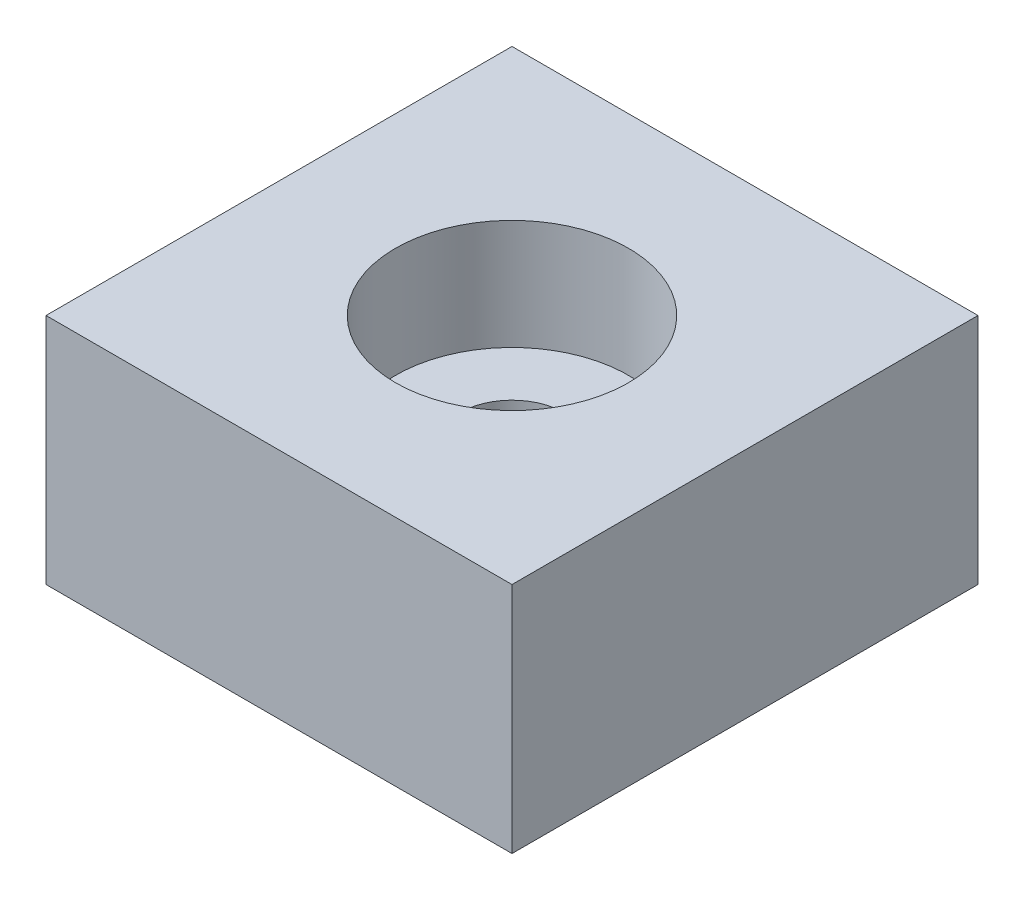
ISO-10303-21;
HEADER;
FILE_DESCRIPTION(('STEP AP214'),'2;1');
FILE_NAME('part.step','',(''),(''),'','','');
FILE_SCHEMA(('AUTOMOTIVE_DESIGN { 1 0 10303 214 1 1 1 1 }'));
ENDSEC;
DATA;
#1=APPLICATION_CONTEXT('core data for automotive mechanical design processes');
#2=APPLICATION_PROTOCOL_DEFINITION('international standard','automotive_design',2000,#1);
#3=PRODUCT_CONTEXT('',#1,'mechanical');
#4=PRODUCT('Part','Part','',(#3));
#5=PRODUCT_RELATED_PRODUCT_CATEGORY('part','',(#4));
#6=PRODUCT_DEFINITION_FORMATION('','',#4);
#7=PRODUCT_DEFINITION_CONTEXT('part definition',#1,'design');
#8=PRODUCT_DEFINITION('design','',#6,#7);
#9=PRODUCT_DEFINITION_SHAPE('','',#8);
#10=(LENGTH_UNIT() NAMED_UNIT(*) SI_UNIT(.MILLI.,.METRE.));
#11=(NAMED_UNIT(*) PLANE_ANGLE_UNIT() SI_UNIT($,.RADIAN.));
#12=(NAMED_UNIT(*) SI_UNIT($,.STERADIAN.) SOLID_ANGLE_UNIT());
#13=UNCERTAINTY_MEASURE_WITH_UNIT(LENGTH_MEASURE(1.E-05),#10,'distance_accuracy_value','');
#14=(GEOMETRIC_REPRESENTATION_CONTEXT(3) GLOBAL_UNCERTAINTY_ASSIGNED_CONTEXT((#13)) GLOBAL_UNIT_ASSIGNED_CONTEXT((#10,
#11,#12)) REPRESENTATION_CONTEXT('',''));
#15=CARTESIAN_POINT('',(0.,0.,0.));
#16=DIRECTION('',(0.,0.,1.));
#17=DIRECTION('',(1.,0.,0.));
#18=AXIS2_PLACEMENT_3D('',#15,#16,#17);
#19=CARTESIAN_POINT('',(0.,19.05,0.));
#20=DIRECTION('',(0.,1.,0.));
#21=DIRECTION('',(0.,0.,1.));
#22=AXIS2_PLACEMENT_3D('',#19,#20,#21);
#23=CYLINDRICAL_SURFACE('',#22,4.25);
#24=CARTESIAN_POINT('',(0.,0.,0.));
#25=DIRECTION('',(0.,1.,0.));
#26=DIRECTION('',(0.,0.,1.));
#27=AXIS2_PLACEMENT_3D('',#24,#25,#26);
#28=CIRCLE('',#27,4.25);
#29=CARTESIAN_POINT('',(0.,0.,4.25));
#30=VERTEX_POINT('',#29);
#31=EDGE_CURVE('E121',#30,#30,#28,.T.);
#32=ORIENTED_EDGE('',*,*,#31,.F.);
#33=EDGE_LOOP('',(#32));
#34=FACE_BOUND('',#33,.T.);
#35=CARTESIAN_POINT('',(0.,10.05,0.));
#36=DIRECTION('',(0.,1.,0.));
#37=DIRECTION('',(0.,0.,1.));
#38=AXIS2_PLACEMENT_3D('',#35,#36,#37);
#39=CIRCLE('',#38,4.25);
#40=CARTESIAN_POINT('',(0.,10.05,4.25));
#41=VERTEX_POINT('',#40);
#42=EDGE_CURVE('E56',#41,#41,#39,.F.);
#43=ORIENTED_EDGE('',*,*,#42,.F.);
#44=EDGE_LOOP('',(#43));
#45=FACE_BOUND('',#44,.T.);
#46=ADVANCED_FACE('F52',(#34,#45),#23,.F.);
#47=CARTESIAN_POINT('',(19.05,19.05,19.05));
#48=DIRECTION('',(-1.,0.,0.));
#49=DIRECTION('',(0.,0.,1.));
#50=AXIS2_PLACEMENT_3D('',#47,#48,#49);
#51=PLANE('',#50);
#52=DIRECTION('',(0.,0.,-1.));
#53=VECTOR('',#52,1.);
#54=CARTESIAN_POINT('',(19.05,0.,19.05));
#55=LINE('',#54,#53);
#56=CARTESIAN_POINT('',(19.05,0.,19.05));
#57=VERTEX_POINT('',#56);
#58=CARTESIAN_POINT('',(19.05,0.,-19.05));
#59=VERTEX_POINT('',#58);
#60=EDGE_CURVE('E118',#57,#59,#55,.T.);
#61=ORIENTED_EDGE('',*,*,#60,.T.);
#62=DIRECTION('',(0.,-1.,0.));
#63=VECTOR('',#62,1.);
#64=CARTESIAN_POINT('',(19.05,19.05,-19.05));
#65=LINE('',#64,#63);
#66=CARTESIAN_POINT('',(19.05,19.05,-19.05));
#67=VERTEX_POINT('',#66);
#68=EDGE_CURVE('E11',#67,#59,#65,.T.);
#69=ORIENTED_EDGE('',*,*,#68,.F.);
#70=DIRECTION('',(0.,0.,-1.));
#71=VECTOR('',#70,1.);
#72=CARTESIAN_POINT('',(19.05,19.05,19.05));
#73=LINE('',#72,#71);
#74=CARTESIAN_POINT('',(19.05,19.05,19.05));
#75=VERTEX_POINT('',#74);
#76=EDGE_CURVE('E105',#75,#67,#73,.T.);
#77=ORIENTED_EDGE('',*,*,#76,.F.);
#78=DIRECTION('',(0.,-1.,0.));
#79=VECTOR('',#78,1.);
#80=CARTESIAN_POINT('',(19.05,19.05,19.05));
#81=LINE('',#80,#79);
#82=EDGE_CURVE('E114',#75,#57,#81,.T.);
#83=ORIENTED_EDGE('',*,*,#82,.T.);
#84=EDGE_LOOP('',(#61,#69,#77,#83));
#85=FACE_BOUND('',#84,.T.);
#86=ADVANCED_FACE('F54',(#85),#51,.F.);
#87=CARTESIAN_POINT('',(-19.05,19.05,-19.05));
#88=DIRECTION('',(0.,0.,1.));
#89=DIRECTION('',(1.,0.,0.));
#90=AXIS2_PLACEMENT_3D('',#87,#88,#89);
#91=PLANE('',#90);
#92=DIRECTION('',(-1.,0.,0.));
#93=VECTOR('',#92,1.);
#94=CARTESIAN_POINT('',(-19.05,0.,-19.05));
#95=LINE('',#94,#93);
#96=CARTESIAN_POINT('',(-19.05,0.,-19.05));
#97=VERTEX_POINT('',#96);
#98=EDGE_CURVE('E109',#59,#97,#95,.T.);
#99=ORIENTED_EDGE('',*,*,#98,.T.);
#100=DIRECTION('',(0.,-1.,0.));
#101=VECTOR('',#100,1.);
#102=CARTESIAN_POINT('',(-19.05,19.05,-19.05));
#103=LINE('',#102,#101);
#104=CARTESIAN_POINT('',(-19.05,19.05,-19.05));
#105=VERTEX_POINT('',#104);
#106=EDGE_CURVE('E62',#105,#97,#103,.T.);
#107=ORIENTED_EDGE('',*,*,#106,.F.);
#108=DIRECTION('',(-1.,0.,0.));
#109=VECTOR('',#108,1.);
#110=CARTESIAN_POINT('',(-19.05,19.05,-19.05));
#111=LINE('',#110,#109);
#112=EDGE_CURVE('E100',#67,#105,#111,.T.);
#113=ORIENTED_EDGE('',*,*,#112,.F.);
#114=ORIENTED_EDGE('',*,*,#68,.T.);
#115=EDGE_LOOP('',(#99,#107,#113,#114));
#116=FACE_BOUND('',#115,.T.);
#117=ADVANCED_FACE('F108',(#116),#91,.F.);
#118=CARTESIAN_POINT('',(-19.05,19.05,19.05));
#119=DIRECTION('',(1.,0.,0.));
#120=DIRECTION('',(0.,0.,-1.));
#121=AXIS2_PLACEMENT_3D('',#118,#119,#120);
#122=PLANE('',#121);
#123=DIRECTION('',(0.,0.,1.));
#124=VECTOR('',#123,1.);
#125=CARTESIAN_POINT('',(-19.05,0.,19.05));
#126=LINE('',#125,#124);
#127=CARTESIAN_POINT('',(-19.05,0.,19.05));
#128=VERTEX_POINT('',#127);
#129=EDGE_CURVE('E87',#97,#128,#126,.T.);
#130=ORIENTED_EDGE('',*,*,#129,.T.);
#131=DIRECTION('',(0.,-1.,0.));
#132=VECTOR('',#131,1.);
#133=CARTESIAN_POINT('',(-19.05,19.05,19.05));
#134=LINE('',#133,#132);
#135=CARTESIAN_POINT('',(-19.05,19.05,19.05));
#136=VERTEX_POINT('',#135);
#137=EDGE_CURVE('E110',#136,#128,#134,.T.);
#138=ORIENTED_EDGE('',*,*,#137,.F.);
#139=DIRECTION('',(0.,0.,1.));
#140=VECTOR('',#139,1.);
#141=CARTESIAN_POINT('',(-19.05,19.05,19.05));
#142=LINE('',#141,#140);
#143=EDGE_CURVE('E103',#105,#136,#142,.T.);
#144=ORIENTED_EDGE('',*,*,#143,.F.);
#145=ORIENTED_EDGE('',*,*,#106,.T.);
#146=EDGE_LOOP('',(#130,#138,#144,#145));
#147=FACE_BOUND('',#146,.T.);
#148=ADVANCED_FACE('F112',(#147),#122,.F.);
#149=CARTESIAN_POINT('',(-19.05,19.05,19.05));
#150=DIRECTION('',(0.,0.,-1.));
#151=DIRECTION('',(-1.,0.,0.));
#152=AXIS2_PLACEMENT_3D('',#149,#150,#151);
#153=PLANE('',#152);
#154=DIRECTION('',(1.,0.,0.));
#155=VECTOR('',#154,1.);
#156=CARTESIAN_POINT('',(-19.05,0.,19.05));
#157=LINE('',#156,#155);
#158=EDGE_CURVE('E93',#128,#57,#157,.T.);
#159=ORIENTED_EDGE('',*,*,#158,.T.);
#160=ORIENTED_EDGE('',*,*,#82,.F.);
#161=DIRECTION('',(1.,0.,0.));
#162=VECTOR('',#161,1.);
#163=CARTESIAN_POINT('',(-19.05,19.05,19.05));
#164=LINE('',#163,#162);
#165=EDGE_CURVE('E70',#136,#75,#164,.T.);
#166=ORIENTED_EDGE('',*,*,#165,.F.);
#167=ORIENTED_EDGE('',*,*,#137,.T.);
#168=EDGE_LOOP('',(#159,#160,#166,#167));
#169=FACE_BOUND('',#168,.T.);
#170=ADVANCED_FACE('F126',(#169),#153,.F.);
#171=CARTESIAN_POINT('',(0.,19.05,0.));
#172=DIRECTION('',(0.,-1.,0.));
#173=DIRECTION('',(0.,0.,-1.));
#174=AXIS2_PLACEMENT_3D('',#171,#172,#173);
#175=PLANE('',#174);
#176=CARTESIAN_POINT('',(0.,19.05,0.));
#177=DIRECTION('',(0.,1.,0.));
#178=DIRECTION('',(0.,0.,1.));
#179=AXIS2_PLACEMENT_3D('',#176,#177,#178);
#180=CIRCLE('',#179,9.52500000000001);
#181=CARTESIAN_POINT('',(0.,19.05,9.52500000000001));
#182=VERTEX_POINT('',#181);
#183=EDGE_CURVE('E134',#182,#182,#180,.T.);
#184=ORIENTED_EDGE('',*,*,#183,.F.);
#185=EDGE_LOOP('',(#184));
#186=FACE_BOUND('',#185,.T.);
#187=ORIENTED_EDGE('',*,*,#76,.T.);
#188=ORIENTED_EDGE('',*,*,#112,.T.);
#189=ORIENTED_EDGE('',*,*,#143,.T.);
#190=ORIENTED_EDGE('',*,*,#165,.T.);
#191=EDGE_LOOP('',(#187,#188,#189,#190));
#192=FACE_BOUND('',#191,.T.);
#193=ADVANCED_FACE('F101',(#186,#192),#175,.F.);
#194=CARTESIAN_POINT('',(0.,0.,0.));
#195=DIRECTION('',(0.,-1.,0.));
#196=DIRECTION('',(0.,0.,-1.));
#197=AXIS2_PLACEMENT_3D('',#194,#195,#196);
#198=PLANE('',#197);
#199=ORIENTED_EDGE('',*,*,#31,.T.);
#200=EDGE_LOOP('',(#199));
#201=FACE_BOUND('',#200,.T.);
#202=ORIENTED_EDGE('',*,*,#60,.F.);
#203=ORIENTED_EDGE('',*,*,#158,.F.);
#204=ORIENTED_EDGE('',*,*,#129,.F.);
#205=ORIENTED_EDGE('',*,*,#98,.F.);
#206=EDGE_LOOP('',(#202,#203,#204,#205));
#207=FACE_BOUND('',#206,.T.);
#208=ADVANCED_FACE('F129',(#201,#207),#198,.T.);
#209=CARTESIAN_POINT('',(0.,10.05,0.));
#210=DIRECTION('',(0.,1.,0.));
#211=DIRECTION('',(0.,0.,1.));
#212=AXIS2_PLACEMENT_3D('',#209,#210,#211);
#213=PLANE('',#212);
#214=CARTESIAN_POINT('',(0.,10.05,0.));
#215=DIRECTION('',(0.,1.,0.));
#216=DIRECTION('',(0.,0.,1.));
#217=AXIS2_PLACEMENT_3D('',#214,#215,#216);
#218=CIRCLE('',#217,9.52500000000001);
#219=CARTESIAN_POINT('',(0.,10.05,9.52500000000001));
#220=VERTEX_POINT('',#219);
#221=EDGE_CURVE('E137',#220,#220,#218,.T.);
#222=ORIENTED_EDGE('',*,*,#221,.T.);
#223=EDGE_LOOP('',(#222));
#224=FACE_BOUND('',#223,.T.);
#225=ORIENTED_EDGE('',*,*,#42,.T.);
#226=EDGE_LOOP('',(#225));
#227=FACE_BOUND('',#226,.T.);
#228=ADVANCED_FACE('F144',(#224,#227),#213,.T.);
#229=CARTESIAN_POINT('',(0.,10.05,0.));
#230=DIRECTION('',(0.,1.,0.));
#231=DIRECTION('',(0.,0.,1.));
#232=AXIS2_PLACEMENT_3D('',#229,#230,#231);
#233=CYLINDRICAL_SURFACE('',#232,9.52500000000001);
#234=ORIENTED_EDGE('',*,*,#221,.F.);
#235=EDGE_LOOP('',(#234));
#236=FACE_BOUND('',#235,.T.);
#237=ORIENTED_EDGE('',*,*,#183,.T.);
#238=EDGE_LOOP('',(#237));
#239=FACE_BOUND('',#238,.T.);
#240=ADVANCED_FACE('F155',(#236,#239),#233,.F.);
#241=CLOSED_SHELL('',(#46,#86,#117,#148,#170,#193,#208,#228,#240));
#242=MANIFOLD_SOLID_BREP('B2',#241);
#243=ADVANCED_BREP_SHAPE_REPRESENTATION('',(#18,#242),#14);
#244=SHAPE_DEFINITION_REPRESENTATION(#9,#243);
ENDSEC;
END-ISO-10303-21;
